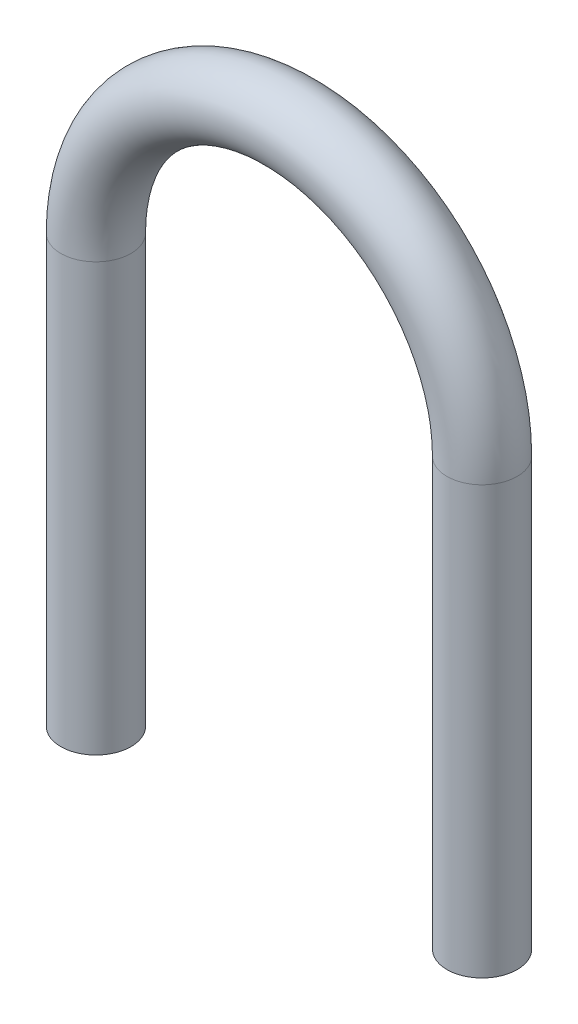
ISO-10303-21;
HEADER;
FILE_DESCRIPTION(('STEP AP214'),'2;1');
FILE_NAME('part.step','',(''),(''),'','','');
FILE_SCHEMA(('AUTOMOTIVE_DESIGN { 1 0 10303 214 1 1 1 1 }'));
ENDSEC;
DATA;
#1=APPLICATION_CONTEXT('core data for automotive mechanical design processes');
#2=APPLICATION_PROTOCOL_DEFINITION('international standard','automotive_design',2000,#1);
#3=PRODUCT_CONTEXT('',#1,'mechanical');
#4=PRODUCT('Part','Part','',(#3));
#5=PRODUCT_RELATED_PRODUCT_CATEGORY('part','',(#4));
#6=PRODUCT_DEFINITION_FORMATION('','',#4);
#7=PRODUCT_DEFINITION_CONTEXT('part definition',#1,'design');
#8=PRODUCT_DEFINITION('design','',#6,#7);
#9=PRODUCT_DEFINITION_SHAPE('','',#8);
#10=(LENGTH_UNIT() NAMED_UNIT(*) SI_UNIT(.MILLI.,.METRE.));
#11=(NAMED_UNIT(*) PLANE_ANGLE_UNIT() SI_UNIT($,.RADIAN.));
#12=(NAMED_UNIT(*) SI_UNIT($,.STERADIAN.) SOLID_ANGLE_UNIT());
#13=UNCERTAINTY_MEASURE_WITH_UNIT(LENGTH_MEASURE(1.E-05),#10,'distance_accuracy_value','');
#14=(GEOMETRIC_REPRESENTATION_CONTEXT(3) GLOBAL_UNCERTAINTY_ASSIGNED_CONTEXT((#13)) GLOBAL_UNIT_ASSIGNED_CONTEXT((#10,
#11,#12)) REPRESENTATION_CONTEXT('',''));
#15=CARTESIAN_POINT('',(0.,0.,0.));
#16=DIRECTION('',(0.,0.,1.));
#17=DIRECTION('',(1.,0.,0.));
#18=AXIS2_PLACEMENT_3D('',#15,#16,#17);
#19=CARTESIAN_POINT('',(-16.5,0.,0.));
#20=DIRECTION('',(0.,1.,0.));
#21=DIRECTION('',(0.,0.,1.));
#22=AXIS2_PLACEMENT_3D('',#19,#20,#21);
#23=PLANE('',#22);
#24=CARTESIAN_POINT('',(-16.5,0.,0.));
#25=DIRECTION('',(0.,1.,0.));
#26=DIRECTION('',(0.,0.,1.));
#27=AXIS2_PLACEMENT_3D('',#24,#25,#26);
#28=CIRCLE('',#27,3.);
#29=CARTESIAN_POINT('',(-16.5,0.,3.));
#30=VERTEX_POINT('',#29);
#31=EDGE_CURVE('E55',#30,#30,#28,.T.);
#32=ORIENTED_EDGE('',*,*,#31,.F.);
#33=EDGE_LOOP('',(#32));
#34=FACE_BOUND('',#33,.T.);
#35=ADVANCED_FACE('F41',(#34),#23,.F.);
#36=CARTESIAN_POINT('',(16.5,0.,0.));
#37=DIRECTION('',(0.,-1.,0.));
#38=DIRECTION('',(0.,0.,1.));
#39=AXIS2_PLACEMENT_3D('',#36,#37,#38);
#40=PLANE('',#39);
#41=CARTESIAN_POINT('',(16.5,0.,0.));
#42=DIRECTION('',(0.,-1.,0.));
#43=DIRECTION('',(0.,0.,1.));
#44=AXIS2_PLACEMENT_3D('',#41,#42,#43);
#45=CIRCLE('',#44,3.);
#46=CARTESIAN_POINT('',(16.5,0.,3.));
#47=VERTEX_POINT('',#46);
#48=EDGE_CURVE('E10',#47,#47,#45,.T.);
#49=ORIENTED_EDGE('',*,*,#48,.T.);
#50=EDGE_LOOP('',(#49));
#51=FACE_BOUND('',#50,.T.);
#52=ADVANCED_FACE('F64',(#51),#40,.T.);
#53=CARTESIAN_POINT('',(-16.5,0.,0.));
#54=DIRECTION('',(0.,1.,0.));
#55=DIRECTION('',(-1.,0.,0.));
#56=AXIS2_PLACEMENT_3D('',#53,#54,#55);
#57=CYLINDRICAL_SURFACE('',#56,3.);
#58=CARTESIAN_POINT('',(-16.5,36.5,0.));
#59=DIRECTION('',(0.,1.,0.));
#60=DIRECTION('',(0.,0.,1.));
#61=AXIS2_PLACEMENT_3D('',#58,#59,#60);
#62=CIRCLE('',#61,3.);
#63=CARTESIAN_POINT('',(-19.5,36.5,0.));
#64=VERTEX_POINT('',#63);
#65=EDGE_CURVE('E51',#64,#64,#62,.T.);
#66=ORIENTED_EDGE('',*,*,#65,.F.);
#67=EDGE_LOOP('',(#66));
#68=FACE_BOUND('',#67,.T.);
#69=ORIENTED_EDGE('',*,*,#31,.T.);
#70=EDGE_LOOP('',(#69));
#71=FACE_BOUND('',#70,.T.);
#72=ADVANCED_FACE('F61',(#68,#71),#57,.T.);
#73=CARTESIAN_POINT('',(0.,36.5,0.));
#74=DIRECTION('',(0.,0.,-1.));
#75=DIRECTION('',(-1.,0.,0.));
#76=AXIS2_PLACEMENT_3D('',#73,#74,#75);
#77=TOROIDAL_SURFACE('',#76,16.5,3.);
#78=CARTESIAN_POINT('',(16.5,36.5,0.));
#79=DIRECTION('',(0.,-1.,0.));
#80=DIRECTION('',(0.,0.,1.));
#81=AXIS2_PLACEMENT_3D('',#78,#79,#80);
#82=CIRCLE('',#81,3.);
#83=CARTESIAN_POINT('',(19.5,36.5,0.));
#84=VERTEX_POINT('',#83);
#85=EDGE_CURVE('E47',#84,#84,#82,.T.);
#86=CARTESIAN_POINT('',(0.,36.5,0.));
#87=DIRECTION('',(0.,0.,-1.));
#88=DIRECTION('',(-1.,0.,0.));
#89=AXIS2_PLACEMENT_3D('',#86,#87,#88);
#90=CIRCLE('',#89,19.5);
#91=EDGE_CURVE('',#64,#84,#90,.T.);
#92=ORIENTED_EDGE('',*,*,#65,.T.);
#93=ORIENTED_EDGE('',*,*,#85,.F.);
#94=ORIENTED_EDGE('',*,*,#91,.T.);
#95=ORIENTED_EDGE('',*,*,#91,.F.);
#96=EDGE_LOOP('',(#92,#94,#93,#95));
#97=FACE_BOUND('',#96,.T.);
#98=ADVANCED_FACE('F70',(#97),#77,.T.);
#99=CARTESIAN_POINT('',(16.5,36.5,0.));
#100=DIRECTION('',(0.,-1.,0.));
#101=DIRECTION('',(1.,0.,0.));
#102=AXIS2_PLACEMENT_3D('',#99,#100,#101);
#103=CYLINDRICAL_SURFACE('',#102,3.);
#104=ORIENTED_EDGE('',*,*,#48,.F.);
#105=EDGE_LOOP('',(#104));
#106=FACE_BOUND('',#105,.T.);
#107=ORIENTED_EDGE('',*,*,#85,.T.);
#108=EDGE_LOOP('',(#107));
#109=FACE_BOUND('',#108,.T.);
#110=ADVANCED_FACE('F68',(#106,#109),#103,.T.);
#111=CLOSED_SHELL('',(#35,#52,#72,#98,#110));
#112=MANIFOLD_SOLID_BREP('B2',#111);
#113=ADVANCED_BREP_SHAPE_REPRESENTATION('',(#18,#112),#14);
#114=SHAPE_DEFINITION_REPRESENTATION(#9,#113);
ENDSEC;
END-ISO-10303-21;
